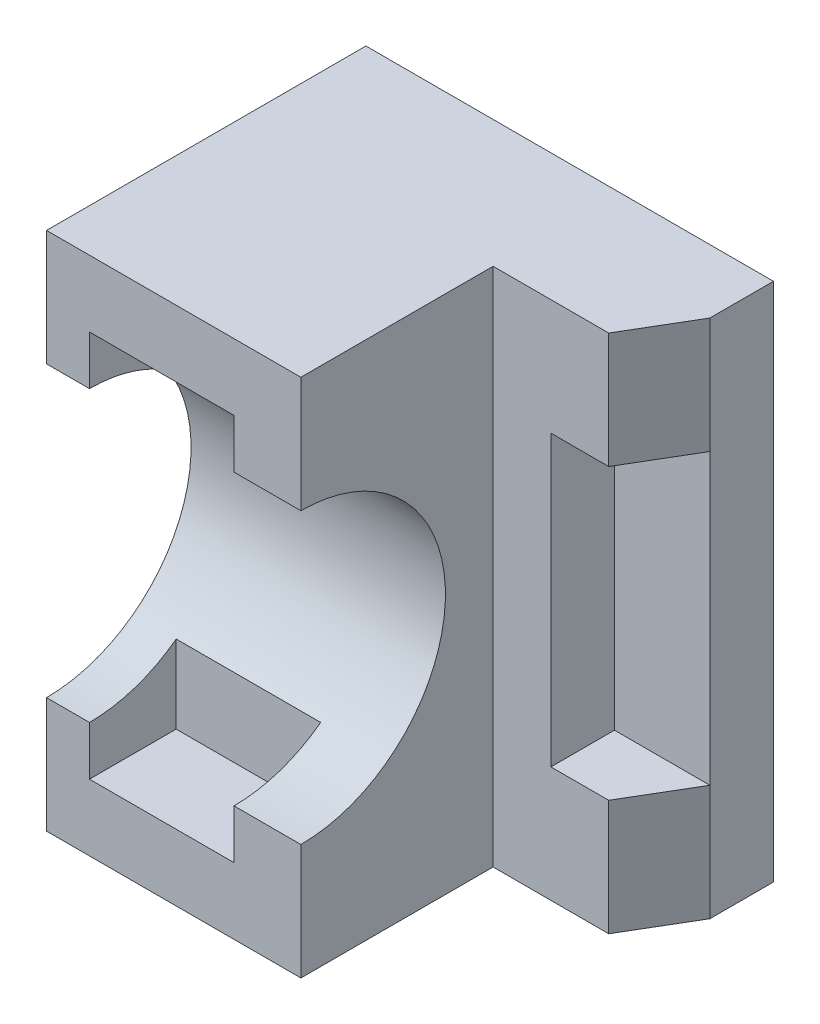
ISO-10303-21;
HEADER;
FILE_DESCRIPTION(('STEP AP214'),'2;1');
FILE_NAME('part.step','',(''),(''),'','','');
FILE_SCHEMA(('AUTOMOTIVE_DESIGN { 1 0 10303 214 1 1 1 1 }'));
ENDSEC;
DATA;
#1=APPLICATION_CONTEXT('core data for automotive mechanical design processes');
#2=APPLICATION_PROTOCOL_DEFINITION('international standard','automotive_design',2000,#1);
#3=PRODUCT_CONTEXT('',#1,'mechanical');
#4=PRODUCT('Part','Part','',(#3));
#5=PRODUCT_RELATED_PRODUCT_CATEGORY('part','',(#4));
#6=PRODUCT_DEFINITION_FORMATION('','',#4);
#7=PRODUCT_DEFINITION_CONTEXT('part definition',#1,'design');
#8=PRODUCT_DEFINITION('design','',#6,#7);
#9=PRODUCT_DEFINITION_SHAPE('','',#8);
#10=(LENGTH_UNIT() NAMED_UNIT(*) SI_UNIT(.MILLI.,.METRE.));
#11=(NAMED_UNIT(*) PLANE_ANGLE_UNIT() SI_UNIT($,.RADIAN.));
#12=(NAMED_UNIT(*) SI_UNIT($,.STERADIAN.) SOLID_ANGLE_UNIT());
#13=UNCERTAINTY_MEASURE_WITH_UNIT(LENGTH_MEASURE(1.E-05),#10,'distance_accuracy_value','');
#14=(GEOMETRIC_REPRESENTATION_CONTEXT(3) GLOBAL_UNCERTAINTY_ASSIGNED_CONTEXT((#13)) GLOBAL_UNIT_ASSIGNED_CONTEXT((#10,
#11,#12)) REPRESENTATION_CONTEXT('',''));
#15=CARTESIAN_POINT('',(0.,0.,0.));
#16=DIRECTION('',(0.,0.,1.));
#17=DIRECTION('',(1.,0.,0.));
#18=AXIS2_PLACEMENT_3D('',#15,#16,#17);
#19=CARTESIAN_POINT('',(28.75,45.,22.));
#20=DIRECTION('',(-0.860926528214316,0.,-0.508729312126641));
#21=DIRECTION('',(-0.508729312126641,0.,0.860926528214316));
#22=AXIS2_PLACEMENT_3D('',#19,#20,#21);
#23=PLANE('',#22);
#24=DIRECTION('',(-0.508729312126641,0.,0.860926528214316));
#25=VECTOR('',#24,1.);
#26=CARTESIAN_POINT('',(28.75,25.,22.));
#27=LINE('',#26,#25);
#28=CARTESIAN_POINT('',(35.25,25.,11.));
#29=VERTEX_POINT('',#28);
#30=CARTESIAN_POINT('',(28.75,25.,22.));
#31=VERTEX_POINT('',#30);
#32=EDGE_CURVE('E214',#29,#31,#27,.T.);
#33=ORIENTED_EDGE('',*,*,#32,.F.);
#34=DIRECTION('',(0.,-1.,0.));
#35=VECTOR('',#34,1.);
#36=CARTESIAN_POINT('',(35.25,45.,11.));
#37=LINE('',#36,#35);
#38=CARTESIAN_POINT('',(35.25,45.,11.));
#39=VERTEX_POINT('',#38);
#40=EDGE_CURVE('E285',#39,#29,#37,.T.);
#41=ORIENTED_EDGE('',*,*,#40,.F.);
#42=DIRECTION('',(0.508729312126641,0.,-0.860926528214316));
#43=VECTOR('',#42,1.);
#44=CARTESIAN_POINT('',(28.75,45.,22.));
#45=LINE('',#44,#43);
#46=CARTESIAN_POINT('',(28.75,45.,22.));
#47=VERTEX_POINT('',#46);
#48=EDGE_CURVE('E274',#47,#39,#45,.T.);
#49=ORIENTED_EDGE('',*,*,#48,.F.);
#50=DIRECTION('',(0.,-1.,0.));
#51=VECTOR('',#50,1.);
#52=CARTESIAN_POINT('',(28.75,45.,22.));
#53=LINE('',#52,#51);
#54=EDGE_CURVE('E290',#47,#31,#53,.T.);
#55=ORIENTED_EDGE('',*,*,#54,.T.);
#56=EDGE_LOOP('',(#33,#41,#49,#55));
#57=FACE_BOUND('',#56,.T.);
#58=ADVANCED_FACE('F37',(#57),#23,.F.);
#59=CARTESIAN_POINT('',(8.75000000000002,45.,22.));
#60=DIRECTION('',(0.,0.,-1.));
#61=DIRECTION('',(-1.,0.,0.));
#62=AXIS2_PLACEMENT_3D('',#59,#60,#61);
#63=PLANE('',#62);
#64=DIRECTION('',(1.,0.,0.));
#65=VECTOR('',#64,1.);
#66=CARTESIAN_POINT('',(18.75,25.,22.));
#67=LINE('',#66,#65);
#68=CARTESIAN_POINT('',(18.75,25.,22.));
#69=VERTEX_POINT('',#68);
#70=EDGE_CURVE('E201',#69,#31,#67,.T.);
#71=ORIENTED_EDGE('',*,*,#70,.T.);
#72=ORIENTED_EDGE('',*,*,#54,.F.);
#73=DIRECTION('',(1.,0.,0.));
#74=VECTOR('',#73,1.);
#75=CARTESIAN_POINT('',(8.75000000000002,45.,22.));
#76=LINE('',#75,#74);
#77=CARTESIAN_POINT('',(8.75000000000002,45.,22.));
#78=VERTEX_POINT('',#77);
#79=EDGE_CURVE('E270',#78,#47,#76,.T.);
#80=ORIENTED_EDGE('',*,*,#79,.F.);
#81=DIRECTION('',(0.,-1.,0.));
#82=VECTOR('',#81,1.);
#83=CARTESIAN_POINT('',(8.75000000000002,45.,22.));
#84=LINE('',#83,#82);
#85=CARTESIAN_POINT('',(8.75000000000002,-45.,22.));
#86=VERTEX_POINT('',#85);
#87=EDGE_CURVE('E294',#78,#86,#84,.T.);
#88=ORIENTED_EDGE('',*,*,#87,.T.);
#89=DIRECTION('',(1.,0.,0.));
#90=VECTOR('',#89,1.);
#91=CARTESIAN_POINT('',(8.75000000000002,-45.,22.));
#92=LINE('',#91,#90);
#93=CARTESIAN_POINT('',(28.75,-45.,22.));
#94=VERTEX_POINT('',#93);
#95=EDGE_CURVE('E280',#86,#94,#92,.T.);
#96=ORIENTED_EDGE('',*,*,#95,.T.);
#97=CARTESIAN_POINT('',(28.75,-25.,22.));
#98=VERTEX_POINT('',#97);
#99=EDGE_CURVE('E293',#98,#94,#53,.T.);
#100=ORIENTED_EDGE('',*,*,#99,.F.);
#101=DIRECTION('',(1.,0.,0.));
#102=VECTOR('',#101,1.);
#103=CARTESIAN_POINT('',(18.75,-25.,22.));
#104=LINE('',#103,#102);
#105=CARTESIAN_POINT('',(18.75,-25.,22.));
#106=VERTEX_POINT('',#105);
#107=EDGE_CURVE('E204',#106,#98,#104,.T.);
#108=ORIENTED_EDGE('',*,*,#107,.F.);
#109=DIRECTION('',(0.,-1.,0.));
#110=VECTOR('',#109,1.);
#111=CARTESIAN_POINT('',(18.75,25.,22.));
#112=LINE('',#111,#110);
#113=EDGE_CURVE('E52',#69,#106,#112,.T.);
#114=ORIENTED_EDGE('',*,*,#113,.F.);
#115=EDGE_LOOP('',(#71,#72,#80,#88,#96,#100,#108,#114));
#116=FACE_BOUND('',#115,.T.);
#117=ADVANCED_FACE('F389',(#116),#63,.F.);
#118=CARTESIAN_POINT('',(0.,0.,55.25));
#119=DIRECTION('',(0.,0.,1.));
#120=DIRECTION('',(1.,0.,0.));
#121=AXIS2_PLACEMENT_3D('',#118,#119,#120);
#122=PLANE('',#121);
#123=DIRECTION('',(0.,-1.,0.));
#124=VECTOR('',#123,1.);
#125=CARTESIAN_POINT('',(-27.8234975951053,-33.5,55.25));
#126=LINE('',#125,#124);
#127=CARTESIAN_POINT('',(-27.8234975951053,-25.,55.25));
#128=VERTEX_POINT('',#127);
#129=CARTESIAN_POINT('',(-27.8234975951053,-33.5,55.25));
#130=VERTEX_POINT('',#129);
#131=EDGE_CURVE('E227',#128,#130,#126,.T.);
#132=ORIENTED_EDGE('',*,*,#131,.F.);
#133=DIRECTION('',(1.,0.,0.));
#134=VECTOR('',#133,1.);
#135=CARTESIAN_POINT('',(-35.25,-25.,55.25));
#136=LINE('',#135,#134);
#137=CARTESIAN_POINT('',(-35.25,-25.,55.25));
#138=VERTEX_POINT('',#137);
#139=EDGE_CURVE('E259',#138,#128,#136,.T.);
#140=ORIENTED_EDGE('',*,*,#139,.F.);
#141=DIRECTION('',(0.,-1.,0.));
#142=VECTOR('',#141,1.);
#143=CARTESIAN_POINT('',(-35.25,45.,55.25));
#144=LINE('',#143,#142);
#145=CARTESIAN_POINT('',(-35.25,-45.,55.25));
#146=VERTEX_POINT('',#145);
#147=EDGE_CURVE('E301',#138,#146,#144,.T.);
#148=ORIENTED_EDGE('',*,*,#147,.T.);
#149=DIRECTION('',(1.,0.,0.));
#150=VECTOR('',#149,1.);
#151=CARTESIAN_POINT('',(-35.25,-45.,55.25));
#152=LINE('',#151,#150);
#153=CARTESIAN_POINT('',(8.75000000000001,-45.,55.25));
#154=VERTEX_POINT('',#153);
#155=EDGE_CURVE('E306',#146,#154,#152,.T.);
#156=ORIENTED_EDGE('',*,*,#155,.T.);
#157=DIRECTION('',(0.,-1.,0.));
#158=VECTOR('',#157,1.);
#159=CARTESIAN_POINT('',(8.75000000000001,45.,55.25));
#160=LINE('',#159,#158);
#161=CARTESIAN_POINT('',(8.75000000000001,-25.,55.25));
#162=VERTEX_POINT('',#161);
#163=EDGE_CURVE('E277',#162,#154,#160,.T.);
#164=ORIENTED_EDGE('',*,*,#163,.F.);
#165=CARTESIAN_POINT('',(-2.82349759510528,-25.,55.25));
#166=VERTEX_POINT('',#165);
#167=EDGE_CURVE('E263',#166,#162,#136,.T.);
#168=ORIENTED_EDGE('',*,*,#167,.F.);
#169=DIRECTION('',(0.,1.,0.));
#170=VECTOR('',#169,1.);
#171=CARTESIAN_POINT('',(-2.82349759510529,-33.5,55.25));
#172=LINE('',#171,#170);
#173=CARTESIAN_POINT('',(-2.82349759510529,-33.5,55.25));
#174=VERTEX_POINT('',#173);
#175=EDGE_CURVE('E241',#174,#166,#172,.T.);
#176=ORIENTED_EDGE('',*,*,#175,.F.);
#177=DIRECTION('',(1.,0.,0.));
#178=VECTOR('',#177,1.);
#179=CARTESIAN_POINT('',(-27.8234975951053,-33.5,55.25));
#180=LINE('',#179,#178);
#181=EDGE_CURVE('E243',#130,#174,#180,.T.);
#182=ORIENTED_EDGE('',*,*,#181,.F.);
#183=EDGE_LOOP('',(#132,#140,#148,#156,#164,#168,#176,#182));
#184=FACE_BOUND('',#183,.T.);
#185=ADVANCED_FACE('F360',(#184),#122,.T.);
#186=CARTESIAN_POINT('',(35.25,45.,55.25));
#187=DIRECTION('',(-1.,0.,0.));
#188=DIRECTION('',(0.,-1.,0.));
#189=AXIS2_PLACEMENT_3D('',#186,#187,#188);
#190=PLANE('',#189);
#191=DIRECTION('',(0.,0.,-1.));
#192=VECTOR('',#191,1.);
#193=CARTESIAN_POINT('',(35.25,45.,55.25));
#194=LINE('',#193,#192);
#195=CARTESIAN_POINT('',(35.25,45.,0.));
#196=VERTEX_POINT('',#195);
#197=EDGE_CURVE('E325',#39,#196,#194,.T.);
#198=ORIENTED_EDGE('',*,*,#197,.F.);
#199=ORIENTED_EDGE('',*,*,#40,.T.);
#200=DIRECTION('',(0.,-1.,0.));
#201=VECTOR('',#200,1.);
#202=CARTESIAN_POINT('',(35.25,25.,11.));
#203=LINE('',#202,#201);
#204=CARTESIAN_POINT('',(35.25,-25.,11.));
#205=VERTEX_POINT('',#204);
#206=EDGE_CURVE('E197',#29,#205,#203,.T.);
#207=ORIENTED_EDGE('',*,*,#206,.T.);
#208=CARTESIAN_POINT('',(35.25,-45.,11.));
#209=VERTEX_POINT('',#208);
#210=EDGE_CURVE('E289',#205,#209,#37,.T.);
#211=ORIENTED_EDGE('',*,*,#210,.T.);
#212=DIRECTION('',(0.,0.,-1.));
#213=VECTOR('',#212,1.);
#214=CARTESIAN_POINT('',(35.25,-45.,55.25));
#215=LINE('',#214,#213);
#216=CARTESIAN_POINT('',(35.25,-45.,0.));
#217=VERTEX_POINT('',#216);
#218=EDGE_CURVE('E309',#209,#217,#215,.T.);
#219=ORIENTED_EDGE('',*,*,#218,.T.);
#220=DIRECTION('',(0.,1.,0.));
#221=VECTOR('',#220,1.);
#222=CARTESIAN_POINT('',(35.25,45.,0.));
#223=LINE('',#222,#221);
#224=EDGE_CURVE('E288',#217,#196,#223,.T.);
#225=ORIENTED_EDGE('',*,*,#224,.T.);
#226=EDGE_LOOP('',(#198,#199,#207,#211,#219,#225));
#227=FACE_BOUND('',#226,.T.);
#228=ADVANCED_FACE('F39',(#227),#190,.F.);
#229=CARTESIAN_POINT('',(-35.25,45.,55.25));
#230=DIRECTION('',(0.,-1.,0.));
#231=DIRECTION('',(0.,0.,-1.));
#232=AXIS2_PLACEMENT_3D('',#229,#230,#231);
#233=PLANE('',#232);
#234=ORIENTED_EDGE('',*,*,#79,.T.);
#235=ORIENTED_EDGE('',*,*,#48,.T.);
#236=ORIENTED_EDGE('',*,*,#197,.T.);
#237=DIRECTION('',(-1.,0.,0.));
#238=VECTOR('',#237,1.);
#239=CARTESIAN_POINT('',(-35.25,45.,0.));
#240=LINE('',#239,#238);
#241=CARTESIAN_POINT('',(-35.25,45.,0.));
#242=VERTEX_POINT('',#241);
#243=EDGE_CURVE('E312',#196,#242,#240,.T.);
#244=ORIENTED_EDGE('',*,*,#243,.T.);
#245=DIRECTION('',(0.,0.,-1.));
#246=VECTOR('',#245,1.);
#247=CARTESIAN_POINT('',(-35.25,45.,55.25));
#248=LINE('',#247,#246);
#249=CARTESIAN_POINT('',(-35.25,45.,55.25));
#250=VERTEX_POINT('',#249);
#251=EDGE_CURVE('E322',#250,#242,#248,.T.);
#252=ORIENTED_EDGE('',*,*,#251,.F.);
#253=DIRECTION('',(-1.,0.,0.));
#254=VECTOR('',#253,1.);
#255=CARTESIAN_POINT('',(-35.25,45.,55.25));
#256=LINE('',#255,#254);
#257=CARTESIAN_POINT('',(8.75000000000001,45.,55.25));
#258=VERTEX_POINT('',#257);
#259=EDGE_CURVE('E299',#258,#250,#256,.T.);
#260=ORIENTED_EDGE('',*,*,#259,.F.);
#261=DIRECTION('',(0.,0.,-1.));
#262=VECTOR('',#261,1.);
#263=CARTESIAN_POINT('',(8.75000000000002,45.,22.));
#264=LINE('',#263,#262);
#265=EDGE_CURVE('E267',#258,#78,#264,.T.);
#266=ORIENTED_EDGE('',*,*,#265,.T.);
#267=EDGE_LOOP('',(#234,#235,#236,#244,#252,#260,#266));
#268=FACE_BOUND('',#267,.T.);
#269=ADVANCED_FACE('F392',(#268),#233,.F.);
#270=CARTESIAN_POINT('',(-35.25,45.,55.25));
#271=DIRECTION('',(1.,0.,0.));
#272=DIRECTION('',(0.,1.,0.));
#273=AXIS2_PLACEMENT_3D('',#270,#271,#272);
#274=PLANE('',#273);
#275=ORIENTED_EDGE('',*,*,#147,.F.);
#276=CARTESIAN_POINT('',(-35.25,0.,55.25));
#277=DIRECTION('',(1.,0.,0.));
#278=DIRECTION('',(0.,0.,1.));
#279=AXIS2_PLACEMENT_3D('',#276,#277,#278);
#280=CIRCLE('',#279,25.);
#281=CARTESIAN_POINT('',(-35.25,25.,55.25));
#282=VERTEX_POINT('',#281);
#283=EDGE_CURVE('E253',#138,#282,#280,.T.);
#284=ORIENTED_EDGE('',*,*,#283,.T.);
#285=EDGE_CURVE('E303',#250,#282,#144,.T.);
#286=ORIENTED_EDGE('',*,*,#285,.F.);
#287=ORIENTED_EDGE('',*,*,#251,.T.);
#288=DIRECTION('',(0.,-1.,0.));
#289=VECTOR('',#288,1.);
#290=CARTESIAN_POINT('',(-35.25,45.,0.));
#291=LINE('',#290,#289);
#292=CARTESIAN_POINT('',(-35.25,-45.,0.));
#293=VERTEX_POINT('',#292);
#294=EDGE_CURVE('E314',#242,#293,#291,.T.);
#295=ORIENTED_EDGE('',*,*,#294,.T.);
#296=DIRECTION('',(0.,0.,-1.));
#297=VECTOR('',#296,1.);
#298=CARTESIAN_POINT('',(-35.25,-45.,55.25));
#299=LINE('',#298,#297);
#300=EDGE_CURVE('E319',#146,#293,#299,.T.);
#301=ORIENTED_EDGE('',*,*,#300,.F.);
#302=EDGE_LOOP('',(#275,#284,#286,#287,#295,#301));
#303=FACE_BOUND('',#302,.T.);
#304=ADVANCED_FACE('F354',(#303),#274,.F.);
#305=CARTESIAN_POINT('',(-35.25,-45.,55.25));
#306=DIRECTION('',(0.,1.,0.));
#307=DIRECTION('',(0.,0.,1.));
#308=AXIS2_PLACEMENT_3D('',#305,#306,#307);
#309=PLANE('',#308);
#310=ORIENTED_EDGE('',*,*,#218,.F.);
#311=DIRECTION('',(0.508729312126641,0.,-0.860926528214316));
#312=VECTOR('',#311,1.);
#313=CARTESIAN_POINT('',(28.75,-45.,22.));
#314=LINE('',#313,#312);
#315=EDGE_CURVE('E271',#94,#209,#314,.T.);
#316=ORIENTED_EDGE('',*,*,#315,.F.);
#317=ORIENTED_EDGE('',*,*,#95,.F.);
#318=DIRECTION('',(0.,0.,-1.));
#319=VECTOR('',#318,1.);
#320=CARTESIAN_POINT('',(8.75000000000002,-45.,22.));
#321=LINE('',#320,#319);
#322=EDGE_CURVE('E262',#154,#86,#321,.T.);
#323=ORIENTED_EDGE('',*,*,#322,.F.);
#324=ORIENTED_EDGE('',*,*,#155,.F.);
#325=ORIENTED_EDGE('',*,*,#300,.T.);
#326=DIRECTION('',(1.,0.,0.));
#327=VECTOR('',#326,1.);
#328=CARTESIAN_POINT('',(-35.25,-45.,0.));
#329=LINE('',#328,#327);
#330=EDGE_CURVE('E302',#293,#217,#329,.T.);
#331=ORIENTED_EDGE('',*,*,#330,.T.);
#332=EDGE_LOOP('',(#310,#316,#317,#323,#324,#325,#331));
#333=FACE_BOUND('',#332,.T.);
#334=ADVANCED_FACE('F385',(#333),#309,.F.);
#335=DIRECTION('',(0.,1.,0.));
#336=VECTOR('',#335,1.);
#337=CARTESIAN_POINT('',(-2.82349759510529,33.5,55.25));
#338=LINE('',#337,#336);
#339=CARTESIAN_POINT('',(-2.82349759510528,25.,55.25));
#340=VERTEX_POINT('',#339);
#341=CARTESIAN_POINT('',(-2.82349759510529,33.5,55.25));
#342=VERTEX_POINT('',#341);
#343=EDGE_CURVE('E224',#340,#342,#338,.T.);
#344=ORIENTED_EDGE('',*,*,#343,.F.);
#345=DIRECTION('',(1.,0.,0.));
#346=VECTOR('',#345,1.);
#347=CARTESIAN_POINT('',(-35.25,25.,55.25));
#348=LINE('',#347,#346);
#349=CARTESIAN_POINT('',(8.75000000000001,25.,55.25));
#350=VERTEX_POINT('',#349);
#351=EDGE_CURVE('E256',#340,#350,#348,.T.);
#352=ORIENTED_EDGE('',*,*,#351,.T.);
#353=EDGE_CURVE('E296',#258,#350,#160,.T.);
#354=ORIENTED_EDGE('',*,*,#353,.F.);
#355=ORIENTED_EDGE('',*,*,#259,.T.);
#356=ORIENTED_EDGE('',*,*,#285,.T.);
#357=CARTESIAN_POINT('',(-27.8234975951053,25.,55.25));
#358=VERTEX_POINT('',#357);
#359=EDGE_CURVE('E264',#282,#358,#348,.T.);
#360=ORIENTED_EDGE('',*,*,#359,.T.);
#361=DIRECTION('',(0.,-1.,0.));
#362=VECTOR('',#361,1.);
#363=CARTESIAN_POINT('',(-27.8234975951053,33.5,55.25));
#364=LINE('',#363,#362);
#365=CARTESIAN_POINT('',(-27.8234975951053,33.5,55.25));
#366=VERTEX_POINT('',#365);
#367=EDGE_CURVE('E220',#366,#358,#364,.T.);
#368=ORIENTED_EDGE('',*,*,#367,.F.);
#369=DIRECTION('',(-1.,0.,0.));
#370=VECTOR('',#369,1.);
#371=CARTESIAN_POINT('',(-27.8234975951053,33.5,55.25));
#372=LINE('',#371,#370);
#373=EDGE_CURVE('E226',#342,#366,#372,.T.);
#374=ORIENTED_EDGE('',*,*,#373,.F.);
#375=EDGE_LOOP('',(#344,#352,#354,#355,#356,#360,#368,#374));
#376=FACE_BOUND('',#375,.T.);
#377=ADVANCED_FACE('F346',(#376),#122,.T.);
#378=CARTESIAN_POINT('',(0.,0.,0.));
#379=DIRECTION('',(0.,0.,1.));
#380=DIRECTION('',(1.,0.,0.));
#381=AXIS2_PLACEMENT_3D('',#378,#379,#380);
#382=PLANE('',#381);
#383=ORIENTED_EDGE('',*,*,#224,.F.);
#384=ORIENTED_EDGE('',*,*,#330,.F.);
#385=ORIENTED_EDGE('',*,*,#294,.F.);
#386=ORIENTED_EDGE('',*,*,#243,.F.);
#387=EDGE_LOOP('',(#383,#384,#385,#386));
#388=FACE_BOUND('',#387,.T.);
#389=ADVANCED_FACE('F397',(#388),#382,.F.);
#390=ORIENTED_EDGE('',*,*,#210,.F.);
#391=DIRECTION('',(-0.508729312126641,0.,0.860926528214316));
#392=VECTOR('',#391,1.);
#393=CARTESIAN_POINT('',(28.75,-25.,22.));
#394=LINE('',#393,#392);
#395=EDGE_CURVE('E193',#205,#98,#394,.T.);
#396=ORIENTED_EDGE('',*,*,#395,.T.);
#397=ORIENTED_EDGE('',*,*,#99,.T.);
#398=ORIENTED_EDGE('',*,*,#315,.T.);
#399=EDGE_LOOP('',(#390,#396,#397,#398));
#400=FACE_BOUND('',#399,.T.);
#401=ADVANCED_FACE('F401',(#400),#23,.F.);
#402=CARTESIAN_POINT('',(8.75000000000002,45.,22.));
#403=DIRECTION('',(-1.,0.,0.));
#404=DIRECTION('',(0.,0.,1.));
#405=AXIS2_PLACEMENT_3D('',#402,#403,#404);
#406=PLANE('',#405);
#407=ORIENTED_EDGE('',*,*,#353,.T.);
#408=CARTESIAN_POINT('',(8.75000000000001,0.,55.25));
#409=DIRECTION('',(1.,0.,0.));
#410=DIRECTION('',(0.,0.,1.));
#411=AXIS2_PLACEMENT_3D('',#408,#409,#410);
#412=CIRCLE('',#411,25.);
#413=EDGE_CURVE('E233',#162,#350,#412,.T.);
#414=ORIENTED_EDGE('',*,*,#413,.F.);
#415=ORIENTED_EDGE('',*,*,#163,.T.);
#416=ORIENTED_EDGE('',*,*,#322,.T.);
#417=ORIENTED_EDGE('',*,*,#87,.F.);
#418=ORIENTED_EDGE('',*,*,#265,.F.);
#419=EDGE_LOOP('',(#407,#414,#415,#416,#417,#418));
#420=FACE_BOUND('',#419,.T.);
#421=ADVANCED_FACE('F381',(#420),#406,.F.);
#422=CARTESIAN_POINT('',(-35.25,0.,55.25));
#423=DIRECTION('',(1.,0.,0.));
#424=DIRECTION('',(0.,0.,-1.));
#425=AXIS2_PLACEMENT_3D('',#422,#423,#424);
#426=CYLINDRICAL_SURFACE('',#425,25.);
#427=ORIENTED_EDGE('',*,*,#351,.F.);
#428=CARTESIAN_POINT('',(-2.82349759510528,0.,55.25));
#429=DIRECTION('',(1.,0.,0.));
#430=DIRECTION('',(0.,1.,0.));
#431=AXIS2_PLACEMENT_3D('',#428,#429,#430);
#432=CIRCLE('',#431,25.);
#433=CARTESIAN_POINT('',(-2.82349759510528,20.,40.25));
#434=VERTEX_POINT('',#433);
#435=EDGE_CURVE('E11',#340,#434,#432,.F.);
#436=ORIENTED_EDGE('',*,*,#435,.T.);
#437=DIRECTION('',(1.,0.,0.));
#438=VECTOR('',#437,1.);
#439=CARTESIAN_POINT('',(-35.25,20.,40.25));
#440=LINE('',#439,#438);
#441=CARTESIAN_POINT('',(-27.8234975951053,20.,40.25));
#442=VERTEX_POINT('',#441);
#443=EDGE_CURVE('E336',#442,#434,#440,.T.);
#444=ORIENTED_EDGE('',*,*,#443,.F.);
#445=CARTESIAN_POINT('',(-27.8234975951053,0.,55.25));
#446=DIRECTION('',(-1.,0.,0.));
#447=DIRECTION('',(0.,-1.,0.));
#448=AXIS2_PLACEMENT_3D('',#445,#446,#447);
#449=CIRCLE('',#448,25.);
#450=EDGE_CURVE('E45',#442,#358,#449,.F.);
#451=ORIENTED_EDGE('',*,*,#450,.T.);
#452=ORIENTED_EDGE('',*,*,#359,.F.);
#453=ORIENTED_EDGE('',*,*,#283,.F.);
#454=ORIENTED_EDGE('',*,*,#139,.T.);
#455=CARTESIAN_POINT('',(-27.8234975951053,0.,55.25));
#456=DIRECTION('',(-1.,0.,0.));
#457=DIRECTION('',(0.,-1.,0.));
#458=AXIS2_PLACEMENT_3D('',#455,#456,#457);
#459=CIRCLE('',#458,25.);
#460=CARTESIAN_POINT('',(-27.8234975951053,-20.,40.25));
#461=VERTEX_POINT('',#460);
#462=EDGE_CURVE('E333',#128,#461,#459,.F.);
#463=ORIENTED_EDGE('',*,*,#462,.T.);
#464=DIRECTION('',(1.,0.,0.));
#465=VECTOR('',#464,1.);
#466=CARTESIAN_POINT('',(-35.25,-20.,40.25));
#467=LINE('',#466,#465);
#468=CARTESIAN_POINT('',(-2.82349759510529,-20.,40.25));
#469=VERTEX_POINT('',#468);
#470=EDGE_CURVE('E327',#461,#469,#467,.T.);
#471=ORIENTED_EDGE('',*,*,#470,.T.);
#472=CARTESIAN_POINT('',(-2.82349759510528,0.,55.25));
#473=DIRECTION('',(1.,0.,0.));
#474=DIRECTION('',(0.,1.,0.));
#475=AXIS2_PLACEMENT_3D('',#472,#473,#474);
#476=CIRCLE('',#475,25.);
#477=EDGE_CURVE('E330',#469,#166,#476,.F.);
#478=ORIENTED_EDGE('',*,*,#477,.T.);
#479=ORIENTED_EDGE('',*,*,#167,.T.);
#480=ORIENTED_EDGE('',*,*,#413,.T.);
#481=EDGE_LOOP('',(#427,#436,#444,#451,#452,#453,#454,#463,#471,#478,#479,#480));
#482=FACE_BOUND('',#481,.T.);
#483=ADVANCED_FACE('F341',(#482),#426,.F.);
#484=CARTESIAN_POINT('',(-27.8234975951053,-33.5,40.25));
#485=DIRECTION('',(-1.,0.,0.));
#486=DIRECTION('',(0.,-1.,0.));
#487=AXIS2_PLACEMENT_3D('',#484,#485,#486);
#488=PLANE('',#487);
#489=ORIENTED_EDGE('',*,*,#131,.T.);
#490=DIRECTION('',(0.,0.,1.));
#491=VECTOR('',#490,1.);
#492=CARTESIAN_POINT('',(-27.8234975951053,-33.5,40.25));
#493=LINE('',#492,#491);
#494=CARTESIAN_POINT('',(-27.8234975951053,-33.5,40.25));
#495=VERTEX_POINT('',#494);
#496=EDGE_CURVE('E236',#495,#130,#493,.T.);
#497=ORIENTED_EDGE('',*,*,#496,.F.);
#498=DIRECTION('',(0.,-1.,0.));
#499=VECTOR('',#498,1.);
#500=CARTESIAN_POINT('',(-27.8234975951053,-33.5,40.25));
#501=LINE('',#500,#499);
#502=EDGE_CURVE('E244',#461,#495,#501,.T.);
#503=ORIENTED_EDGE('',*,*,#502,.F.);
#504=ORIENTED_EDGE('',*,*,#462,.F.);
#505=EDGE_LOOP('',(#489,#497,#503,#504));
#506=FACE_BOUND('',#505,.T.);
#507=ADVANCED_FACE('F365',(#506),#488,.F.);
#508=CARTESIAN_POINT('',(-2.82349759510529,-33.5,40.25));
#509=DIRECTION('',(1.,0.,0.));
#510=DIRECTION('',(0.,1.,0.));
#511=AXIS2_PLACEMENT_3D('',#508,#509,#510);
#512=PLANE('',#511);
#513=DIRECTION('',(0.,1.,0.));
#514=VECTOR('',#513,1.);
#515=CARTESIAN_POINT('',(-2.82349759510529,-33.5,40.25));
#516=LINE('',#515,#514);
#517=CARTESIAN_POINT('',(-2.82349759510529,-33.5,40.25));
#518=VERTEX_POINT('',#517);
#519=EDGE_CURVE('E239',#518,#469,#516,.T.);
#520=ORIENTED_EDGE('',*,*,#519,.F.);
#521=DIRECTION('',(0.,0.,1.));
#522=VECTOR('',#521,1.);
#523=CARTESIAN_POINT('',(-2.82349759510529,-33.5,40.25));
#524=LINE('',#523,#522);
#525=EDGE_CURVE('E216',#518,#174,#524,.T.);
#526=ORIENTED_EDGE('',*,*,#525,.T.);
#527=ORIENTED_EDGE('',*,*,#175,.T.);
#528=ORIENTED_EDGE('',*,*,#477,.F.);
#529=EDGE_LOOP('',(#520,#526,#527,#528));
#530=FACE_BOUND('',#529,.T.);
#531=ADVANCED_FACE('F448',(#530),#512,.F.);
#532=CARTESIAN_POINT('',(0.,0.,40.25));
#533=DIRECTION('',(0.,0.,-1.));
#534=DIRECTION('',(-1.,0.,0.));
#535=AXIS2_PLACEMENT_3D('',#532,#533,#534);
#536=PLANE('',#535);
#537=ORIENTED_EDGE('',*,*,#502,.T.);
#538=DIRECTION('',(1.,0.,0.));
#539=VECTOR('',#538,1.);
#540=CARTESIAN_POINT('',(-27.8234975951053,-33.5,40.25));
#541=LINE('',#540,#539);
#542=EDGE_CURVE('E249',#495,#518,#541,.T.);
#543=ORIENTED_EDGE('',*,*,#542,.T.);
#544=ORIENTED_EDGE('',*,*,#519,.T.);
#545=ORIENTED_EDGE('',*,*,#470,.F.);
#546=EDGE_LOOP('',(#537,#543,#544,#545));
#547=FACE_BOUND('',#546,.T.);
#548=ADVANCED_FACE('F372',(#547),#536,.F.);
#549=CARTESIAN_POINT('',(-27.8234975951053,-33.5,40.25));
#550=DIRECTION('',(0.,-1.,0.));
#551=DIRECTION('',(0.,0.,-1.));
#552=AXIS2_PLACEMENT_3D('',#549,#550,#551);
#553=PLANE('',#552);
#554=ORIENTED_EDGE('',*,*,#181,.T.);
#555=ORIENTED_EDGE('',*,*,#525,.F.);
#556=ORIENTED_EDGE('',*,*,#542,.F.);
#557=ORIENTED_EDGE('',*,*,#496,.T.);
#558=EDGE_LOOP('',(#554,#555,#556,#557));
#559=FACE_BOUND('',#558,.T.);
#560=ADVANCED_FACE('F369',(#559),#553,.F.);
#561=CARTESIAN_POINT('',(-2.82349759510529,33.5,40.25));
#562=DIRECTION('',(1.,0.,0.));
#563=DIRECTION('',(0.,1.,0.));
#564=AXIS2_PLACEMENT_3D('',#561,#562,#563);
#565=PLANE('',#564);
#566=ORIENTED_EDGE('',*,*,#343,.T.);
#567=DIRECTION('',(0.,0.,1.));
#568=VECTOR('',#567,1.);
#569=CARTESIAN_POINT('',(-2.82349759510529,33.5,40.25));
#570=LINE('',#569,#568);
#571=CARTESIAN_POINT('',(-2.82349759510529,33.5,40.25));
#572=VERTEX_POINT('',#571);
#573=EDGE_CURVE('E223',#572,#342,#570,.T.);
#574=ORIENTED_EDGE('',*,*,#573,.F.);
#575=DIRECTION('',(0.,1.,0.));
#576=VECTOR('',#575,1.);
#577=CARTESIAN_POINT('',(-2.82349759510529,33.5,40.25));
#578=LINE('',#577,#576);
#579=EDGE_CURVE('E217',#434,#572,#578,.T.);
#580=ORIENTED_EDGE('',*,*,#579,.F.);
#581=ORIENTED_EDGE('',*,*,#435,.F.);
#582=EDGE_LOOP('',(#566,#574,#580,#581));
#583=FACE_BOUND('',#582,.T.);
#584=ADVANCED_FACE('F441',(#583),#565,.F.);
#585=CARTESIAN_POINT('',(-27.8234975951053,33.5,40.25));
#586=DIRECTION('',(-1.,0.,0.));
#587=DIRECTION('',(0.,-1.,0.));
#588=AXIS2_PLACEMENT_3D('',#585,#586,#587);
#589=PLANE('',#588);
#590=DIRECTION('',(0.,-1.,0.));
#591=VECTOR('',#590,1.);
#592=CARTESIAN_POINT('',(-27.8234975951053,33.5,40.25));
#593=LINE('',#592,#591);
#594=CARTESIAN_POINT('',(-27.8234975951053,33.5,40.25));
#595=VERTEX_POINT('',#594);
#596=EDGE_CURVE('E60',#595,#442,#593,.T.);
#597=ORIENTED_EDGE('',*,*,#596,.F.);
#598=DIRECTION('',(0.,0.,1.));
#599=VECTOR('',#598,1.);
#600=CARTESIAN_POINT('',(-27.8234975951053,33.5,40.25));
#601=LINE('',#600,#599);
#602=EDGE_CURVE('E231',#595,#366,#601,.T.);
#603=ORIENTED_EDGE('',*,*,#602,.T.);
#604=ORIENTED_EDGE('',*,*,#367,.T.);
#605=ORIENTED_EDGE('',*,*,#450,.F.);
#606=EDGE_LOOP('',(#597,#603,#604,#605));
#607=FACE_BOUND('',#606,.T.);
#608=ADVANCED_FACE('F439',(#607),#589,.F.);
#609=CARTESIAN_POINT('',(0.,0.,40.25));
#610=DIRECTION('',(0.,0.,1.));
#611=DIRECTION('',(1.,0.,0.));
#612=AXIS2_PLACEMENT_3D('',#609,#610,#611);
#613=PLANE('',#612);
#614=ORIENTED_EDGE('',*,*,#443,.T.);
#615=ORIENTED_EDGE('',*,*,#579,.T.);
#616=DIRECTION('',(-1.,0.,0.));
#617=VECTOR('',#616,1.);
#618=CARTESIAN_POINT('',(-27.8234975951053,33.5,40.25));
#619=LINE('',#618,#617);
#620=EDGE_CURVE('E219',#572,#595,#619,.T.);
#621=ORIENTED_EDGE('',*,*,#620,.T.);
#622=ORIENTED_EDGE('',*,*,#596,.T.);
#623=EDGE_LOOP('',(#614,#615,#621,#622));
#624=FACE_BOUND('',#623,.T.);
#625=ADVANCED_FACE('F430',(#624),#613,.T.);
#626=CARTESIAN_POINT('',(-27.8234975951053,33.5,40.25));
#627=DIRECTION('',(0.,1.,0.));
#628=DIRECTION('',(0.,0.,1.));
#629=AXIS2_PLACEMENT_3D('',#626,#627,#628);
#630=PLANE('',#629);
#631=ORIENTED_EDGE('',*,*,#373,.T.);
#632=ORIENTED_EDGE('',*,*,#602,.F.);
#633=ORIENTED_EDGE('',*,*,#620,.F.);
#634=ORIENTED_EDGE('',*,*,#573,.T.);
#635=EDGE_LOOP('',(#631,#632,#633,#634));
#636=FACE_BOUND('',#635,.T.);
#637=ADVANCED_FACE('F423',(#636),#630,.F.);
#638=CARTESIAN_POINT('',(18.75,25.,11.));
#639=DIRECTION('',(0.,-1.,0.));
#640=DIRECTION('',(1.,0.,0.));
#641=AXIS2_PLACEMENT_3D('',#638,#639,#640);
#642=PLANE('',#641);
#643=ORIENTED_EDGE('',*,*,#32,.T.);
#644=ORIENTED_EDGE('',*,*,#70,.F.);
#645=DIRECTION('',(0.,0.,1.));
#646=VECTOR('',#645,1.);
#647=CARTESIAN_POINT('',(18.75,25.,11.));
#648=LINE('',#647,#646);
#649=CARTESIAN_POINT('',(18.75,25.,11.));
#650=VERTEX_POINT('',#649);
#651=EDGE_CURVE('E186',#650,#69,#648,.T.);
#652=ORIENTED_EDGE('',*,*,#651,.F.);
#653=DIRECTION('',(1.,0.,0.));
#654=VECTOR('',#653,1.);
#655=CARTESIAN_POINT('',(18.75,25.,11.));
#656=LINE('',#655,#654);
#657=EDGE_CURVE('E187',#650,#29,#656,.T.);
#658=ORIENTED_EDGE('',*,*,#657,.T.);
#659=EDGE_LOOP('',(#643,#644,#652,#658));
#660=FACE_BOUND('',#659,.T.);
#661=ADVANCED_FACE('F421',(#660),#642,.T.);
#662=CARTESIAN_POINT('',(18.75,-25.,11.));
#663=DIRECTION('',(0.,-1.,0.));
#664=DIRECTION('',(1.,0.,0.));
#665=AXIS2_PLACEMENT_3D('',#662,#663,#664);
#666=PLANE('',#665);
#667=DIRECTION('',(1.,0.,0.));
#668=VECTOR('',#667,1.);
#669=CARTESIAN_POINT('',(18.75,-25.,11.));
#670=LINE('',#669,#668);
#671=CARTESIAN_POINT('',(18.75,-25.,11.));
#672=VERTEX_POINT('',#671);
#673=EDGE_CURVE('E190',#672,#205,#670,.T.);
#674=ORIENTED_EDGE('',*,*,#673,.F.);
#675=DIRECTION('',(0.,0.,1.));
#676=VECTOR('',#675,1.);
#677=CARTESIAN_POINT('',(18.75,-25.,11.));
#678=LINE('',#677,#676);
#679=EDGE_CURVE('E179',#672,#106,#678,.T.);
#680=ORIENTED_EDGE('',*,*,#679,.T.);
#681=ORIENTED_EDGE('',*,*,#107,.T.);
#682=ORIENTED_EDGE('',*,*,#395,.F.);
#683=EDGE_LOOP('',(#674,#680,#681,#682));
#684=FACE_BOUND('',#683,.T.);
#685=ADVANCED_FACE('F191',(#684),#666,.F.);
#686=CARTESIAN_POINT('',(18.75,25.,11.));
#687=DIRECTION('',(-1.,0.,0.));
#688=DIRECTION('',(0.,-1.,0.));
#689=AXIS2_PLACEMENT_3D('',#686,#687,#688);
#690=PLANE('',#689);
#691=ORIENTED_EDGE('',*,*,#113,.T.);
#692=ORIENTED_EDGE('',*,*,#679,.F.);
#693=DIRECTION('',(0.,-1.,0.));
#694=VECTOR('',#693,1.);
#695=CARTESIAN_POINT('',(18.75,25.,11.));
#696=LINE('',#695,#694);
#697=EDGE_CURVE('E183',#650,#672,#696,.T.);
#698=ORIENTED_EDGE('',*,*,#697,.F.);
#699=ORIENTED_EDGE('',*,*,#651,.T.);
#700=EDGE_LOOP('',(#691,#692,#698,#699));
#701=FACE_BOUND('',#700,.T.);
#702=ADVANCED_FACE('F181',(#701),#690,.F.);
#703=CARTESIAN_POINT('',(0.,0.,11.));
#704=DIRECTION('',(0.,0.,1.));
#705=DIRECTION('',(1.,0.,0.));
#706=AXIS2_PLACEMENT_3D('',#703,#704,#705);
#707=PLANE('',#706);
#708=ORIENTED_EDGE('',*,*,#697,.T.);
#709=ORIENTED_EDGE('',*,*,#673,.T.);
#710=ORIENTED_EDGE('',*,*,#206,.F.);
#711=ORIENTED_EDGE('',*,*,#657,.F.);
#712=EDGE_LOOP('',(#708,#709,#710,#711));
#713=FACE_BOUND('',#712,.T.);
#714=ADVANCED_FACE('F200',(#713),#707,.T.);
#715=CLOSED_SHELL('',(#58,#117,#185,#228,#269,#304,#334,#377,#389,#401,#421,#483,#507,#531,#548,
#560,#584,#608,#625,#637,#661,#685,#702,#714));
#716=MANIFOLD_SOLID_BREP('B2',#715);
#717=ADVANCED_BREP_SHAPE_REPRESENTATION('',(#18,#716),#14);
#718=SHAPE_DEFINITION_REPRESENTATION(#9,#717);
ENDSEC;
END-ISO-10303-21;
